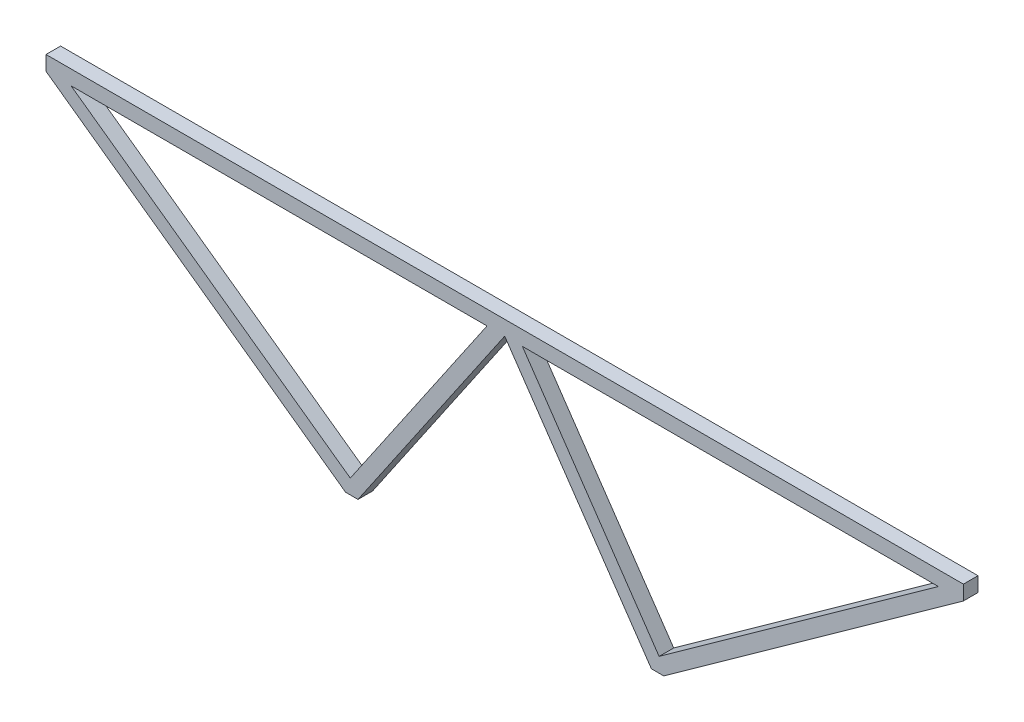
ISO-10303-21;
HEADER;
FILE_DESCRIPTION(('STEP AP214'),'2;1');
FILE_NAME('part.step','',(''),(''),'','','');
FILE_SCHEMA(('AUTOMOTIVE_DESIGN { 1 0 10303 214 1 1 1 1 }'));
ENDSEC;
DATA;
#1=APPLICATION_CONTEXT('core data for automotive mechanical design processes');
#2=APPLICATION_PROTOCOL_DEFINITION('international standard','automotive_design',2000,#1);
#3=PRODUCT_CONTEXT('',#1,'mechanical');
#4=PRODUCT('Part','Part','',(#3));
#5=PRODUCT_RELATED_PRODUCT_CATEGORY('part','',(#4));
#6=PRODUCT_DEFINITION_FORMATION('','',#4);
#7=PRODUCT_DEFINITION_CONTEXT('part definition',#1,'design');
#8=PRODUCT_DEFINITION('design','',#6,#7);
#9=PRODUCT_DEFINITION_SHAPE('','',#8);
#10=(LENGTH_UNIT() NAMED_UNIT(*) SI_UNIT(.MILLI.,.METRE.));
#11=(NAMED_UNIT(*) PLANE_ANGLE_UNIT() SI_UNIT($,.RADIAN.));
#12=(NAMED_UNIT(*) SI_UNIT($,.STERADIAN.) SOLID_ANGLE_UNIT());
#13=UNCERTAINTY_MEASURE_WITH_UNIT(LENGTH_MEASURE(1.E-05),#10,'distance_accuracy_value','');
#14=(GEOMETRIC_REPRESENTATION_CONTEXT(3) GLOBAL_UNCERTAINTY_ASSIGNED_CONTEXT((#13)) GLOBAL_UNIT_ASSIGNED_CONTEXT((#10,
#11,#12)) REPRESENTATION_CONTEXT('',''));
#15=CARTESIAN_POINT('',(0.,0.,0.));
#16=DIRECTION('',(0.,0.,1.));
#17=DIRECTION('',(1.,0.,0.));
#18=AXIS2_PLACEMENT_3D('',#15,#16,#17);
#19=CARTESIAN_POINT('',(0.,0.,19.1));
#20=DIRECTION('',(0.,0.,-1.));
#21=DIRECTION('',(-1.,0.,0.));
#22=AXIS2_PLACEMENT_3D('',#19,#20,#21);
#23=PLANE('',#22);
#24=DIRECTION('',(0.564071784532691,0.825725754651086,0.));
#25=VECTOR('',#24,1.);
#26=CARTESIAN_POINT('',(576.868833396058,-19.1,19.1));
#27=LINE('',#26,#25);
#28=CARTESIAN_POINT('',(398.027381062942,-280.9,19.1));
#29=VERTEX_POINT('',#28);
#30=CARTESIAN_POINT('',(576.868833396058,-19.1,19.1));
#31=VERTEX_POINT('',#30);
#32=EDGE_CURVE('E180',#29,#31,#27,.T.);
#33=ORIENTED_EDGE('',*,*,#32,.F.);
#34=DIRECTION('',(0.812771804546655,-0.582582177665927,0.));
#35=VECTOR('',#34,1.);
#36=CARTESIAN_POINT('',(398.027381062942,-280.9,19.1));
#37=LINE('',#36,#35);
#38=CARTESIAN_POINT('',(32.785074333243,-19.1,19.1));
#39=VERTEX_POINT('',#38);
#40=EDGE_CURVE('E183',#39,#29,#37,.T.);
#41=ORIENTED_EDGE('',*,*,#40,.F.);
#42=DIRECTION('',(-1.,0.,0.));
#43=VECTOR('',#42,1.);
#44=CARTESIAN_POINT('',(32.785074333243,-19.1,19.1));
#45=LINE('',#44,#43);
#46=EDGE_CURVE('E177',#31,#39,#45,.T.);
#47=ORIENTED_EDGE('',*,*,#46,.F.);
#48=EDGE_LOOP('',(#33,#41,#47));
#49=FACE_BOUND('',#48,.T.);
#50=DIRECTION('',(-1.,0.,0.));
#51=VECTOR('',#50,1.);
#52=CARTESIAN_POINT('',(0.,0.,19.1));
#53=LINE('',#52,#51);
#54=CARTESIAN_POINT('',(1200.,0.,19.1));
#55=VERTEX_POINT('',#54);
#56=CARTESIAN_POINT('',(0.,0.,19.1));
#57=VERTEX_POINT('',#56);
#58=EDGE_CURVE('E202',#55,#57,#53,.T.);
#59=ORIENTED_EDGE('',*,*,#58,.T.);
#60=DIRECTION('',(0.,-1.,0.));
#61=VECTOR('',#60,1.);
#62=CARTESIAN_POINT('',(0.,0.,19.1));
#63=LINE('',#62,#61);
#64=CARTESIAN_POINT('',(0.,-19.1,19.1));
#65=VERTEX_POINT('',#64);
#66=EDGE_CURVE('E204',#57,#65,#63,.T.);
#67=ORIENTED_EDGE('',*,*,#66,.T.);
#68=DIRECTION('',(0.812771804546655,-0.582582177665927,0.));
#69=VECTOR('',#68,1.);
#70=CARTESIAN_POINT('',(391.889090757725,-300.,19.1));
#71=LINE('',#70,#69);
#72=CARTESIAN_POINT('',(391.889090757725,-300.,19.1));
#73=VERTEX_POINT('',#72);
#74=EDGE_CURVE('E210',#65,#73,#71,.T.);
#75=ORIENTED_EDGE('',*,*,#74,.T.);
#76=DIRECTION('',(1.,0.,0.));
#77=VECTOR('',#76,1.);
#78=CARTESIAN_POINT('',(391.889090757725,-300.,19.1));
#79=LINE('',#78,#77);
#80=CARTESIAN_POINT('',(408.110909242275,-300.,19.1));
#81=VERTEX_POINT('',#80);
#82=EDGE_CURVE('E207',#73,#81,#79,.T.);
#83=ORIENTED_EDGE('',*,*,#82,.T.);
#84=DIRECTION('',(0.564071784532684,0.825725754651091,0.));
#85=VECTOR('',#84,1.);
#86=CARTESIAN_POINT('',(408.110909242275,-300.,19.1));
#87=LINE('',#86,#85);
#88=CARTESIAN_POINT('',(599.999999999996,-19.1,19.1));
#89=VERTEX_POINT('',#88);
#90=EDGE_CURVE('E213',#81,#89,#87,.T.);
#91=ORIENTED_EDGE('',*,*,#90,.T.);
#92=DIRECTION('',(0.564071784532698,-0.825725754651081,0.));
#93=VECTOR('',#92,1.);
#94=CARTESIAN_POINT('',(791.889090757725,-300.,19.1));
#95=LINE('',#94,#93);
#96=CARTESIAN_POINT('',(791.889090757725,-300.,19.1));
#97=VERTEX_POINT('',#96);
#98=EDGE_CURVE('E211',#89,#97,#95,.T.);
#99=ORIENTED_EDGE('',*,*,#98,.T.);
#100=DIRECTION('',(1.,0.,0.));
#101=VECTOR('',#100,1.);
#102=CARTESIAN_POINT('',(808.110909242275,-300.,19.1));
#103=LINE('',#102,#101);
#104=CARTESIAN_POINT('',(808.110909242275,-300.,19.1));
#105=VERTEX_POINT('',#104);
#106=EDGE_CURVE('E214',#97,#105,#103,.T.);
#107=ORIENTED_EDGE('',*,*,#106,.T.);
#108=DIRECTION('',(0.812771804546655,0.582582177665927,0.));
#109=VECTOR('',#108,1.);
#110=CARTESIAN_POINT('',(808.110909242275,-300.,19.1));
#111=LINE('',#110,#109);
#112=CARTESIAN_POINT('',(1200.,-19.1,19.1));
#113=VERTEX_POINT('',#112);
#114=EDGE_CURVE('E220',#105,#113,#111,.T.);
#115=ORIENTED_EDGE('',*,*,#114,.T.);
#116=DIRECTION('',(0.,1.,0.));
#117=VECTOR('',#116,1.);
#118=CARTESIAN_POINT('',(1200.,0.,19.1));
#119=LINE('',#118,#117);
#120=EDGE_CURVE('E219',#113,#55,#119,.T.);
#121=ORIENTED_EDGE('',*,*,#120,.T.);
#122=EDGE_LOOP('',(#59,#67,#75,#83,#91,#99,#107,#115,#121));
#123=FACE_BOUND('',#122,.T.);
#124=DIRECTION('',(0.564071784532684,-0.825725754651091,0.));
#125=VECTOR('',#124,1.);
#126=CARTESIAN_POINT('',(623.131166603945,-19.1,19.1));
#127=LINE('',#126,#125);
#128=CARTESIAN_POINT('',(623.131166603945,-19.1,19.1));
#129=VERTEX_POINT('',#128);
#130=CARTESIAN_POINT('',(801.972618937058,-280.9,19.1));
#131=VERTEX_POINT('',#130);
#132=EDGE_CURVE('E148',#129,#131,#127,.T.);
#133=ORIENTED_EDGE('',*,*,#132,.F.);
#134=DIRECTION('',(-1.,0.,0.));
#135=VECTOR('',#134,1.);
#136=CARTESIAN_POINT('',(1167.21492566676,-19.1,19.1));
#137=LINE('',#136,#135);
#138=CARTESIAN_POINT('',(1167.21492566676,-19.1,19.1));
#139=VERTEX_POINT('',#138);
#140=EDGE_CURVE('E167',#139,#129,#137,.T.);
#141=ORIENTED_EDGE('',*,*,#140,.F.);
#142=DIRECTION('',(0.812771804546655,0.582582177665927,0.));
#143=VECTOR('',#142,1.);
#144=CARTESIAN_POINT('',(801.972618937058,-280.9,19.1));
#145=LINE('',#144,#143);
#146=EDGE_CURVE('E156',#131,#139,#145,.T.);
#147=ORIENTED_EDGE('',*,*,#146,.F.);
#148=EDGE_LOOP('',(#133,#141,#147));
#149=FACE_BOUND('',#148,.T.);
#150=ADVANCED_FACE('F43',(#49,#123,#149),#23,.F.);
#151=CARTESIAN_POINT('',(0.,0.,0.));
#152=DIRECTION('',(0.,0.,-1.));
#153=DIRECTION('',(-1.,0.,0.));
#154=AXIS2_PLACEMENT_3D('',#151,#152,#153);
#155=PLANE('',#154);
#156=DIRECTION('',(-1.,0.,0.));
#157=VECTOR('',#156,1.);
#158=CARTESIAN_POINT('',(0.,0.,0.));
#159=LINE('',#158,#157);
#160=CARTESIAN_POINT('',(1200.,0.,0.));
#161=VERTEX_POINT('',#160);
#162=CARTESIAN_POINT('',(0.,0.,0.));
#163=VERTEX_POINT('',#162);
#164=EDGE_CURVE('E199',#161,#163,#159,.T.);
#165=ORIENTED_EDGE('',*,*,#164,.F.);
#166=DIRECTION('',(0.,1.,0.));
#167=VECTOR('',#166,1.);
#168=CARTESIAN_POINT('',(1200.,0.,0.));
#169=LINE('',#168,#167);
#170=CARTESIAN_POINT('',(1200.,-19.1,0.));
#171=VERTEX_POINT('',#170);
#172=EDGE_CURVE('E203',#171,#161,#169,.T.);
#173=ORIENTED_EDGE('',*,*,#172,.F.);
#174=DIRECTION('',(0.812771804546655,0.582582177665927,0.));
#175=VECTOR('',#174,1.);
#176=CARTESIAN_POINT('',(808.110909242275,-300.,0.));
#177=LINE('',#176,#175);
#178=CARTESIAN_POINT('',(808.110909242275,-300.,0.));
#179=VERTEX_POINT('',#178);
#180=EDGE_CURVE('E237',#179,#171,#177,.T.);
#181=ORIENTED_EDGE('',*,*,#180,.F.);
#182=DIRECTION('',(1.,0.,0.));
#183=VECTOR('',#182,1.);
#184=CARTESIAN_POINT('',(808.110909242275,-300.,0.));
#185=LINE('',#184,#183);
#186=CARTESIAN_POINT('',(791.889090757725,-300.,0.));
#187=VERTEX_POINT('',#186);
#188=EDGE_CURVE('E233',#187,#179,#185,.T.);
#189=ORIENTED_EDGE('',*,*,#188,.F.);
#190=DIRECTION('',(0.564071784532698,-0.825725754651081,0.));
#191=VECTOR('',#190,1.);
#192=CARTESIAN_POINT('',(791.889090757725,-300.,0.));
#193=LINE('',#192,#191);
#194=CARTESIAN_POINT('',(599.999999999996,-19.1,0.));
#195=VERTEX_POINT('',#194);
#196=EDGE_CURVE('E235',#195,#187,#193,.T.);
#197=ORIENTED_EDGE('',*,*,#196,.F.);
#198=DIRECTION('',(0.564071784532684,0.825725754651091,0.));
#199=VECTOR('',#198,1.);
#200=CARTESIAN_POINT('',(408.110909242275,-300.,0.));
#201=LINE('',#200,#199);
#202=CARTESIAN_POINT('',(408.110909242275,-300.,0.));
#203=VERTEX_POINT('',#202);
#204=EDGE_CURVE('E229',#203,#195,#201,.T.);
#205=ORIENTED_EDGE('',*,*,#204,.F.);
#206=DIRECTION('',(1.,0.,0.));
#207=VECTOR('',#206,1.);
#208=CARTESIAN_POINT('',(391.889090757725,-300.,0.));
#209=LINE('',#208,#207);
#210=CARTESIAN_POINT('',(391.889090757725,-300.,0.));
#211=VERTEX_POINT('',#210);
#212=EDGE_CURVE('E228',#211,#203,#209,.T.);
#213=ORIENTED_EDGE('',*,*,#212,.F.);
#214=DIRECTION('',(0.812771804546655,-0.582582177665927,0.));
#215=VECTOR('',#214,1.);
#216=CARTESIAN_POINT('',(391.889090757725,-300.,0.));
#217=LINE('',#216,#215);
#218=CARTESIAN_POINT('',(0.,-19.1,0.));
#219=VERTEX_POINT('',#218);
#220=EDGE_CURVE('E226',#219,#211,#217,.T.);
#221=ORIENTED_EDGE('',*,*,#220,.F.);
#222=DIRECTION('',(0.,-1.,0.));
#223=VECTOR('',#222,1.);
#224=CARTESIAN_POINT('',(0.,0.,0.));
#225=LINE('',#224,#223);
#226=EDGE_CURVE('E222',#163,#219,#225,.T.);
#227=ORIENTED_EDGE('',*,*,#226,.F.);
#228=EDGE_LOOP('',(#165,#173,#181,#189,#197,#205,#213,#221,#227));
#229=FACE_BOUND('',#228,.T.);
#230=DIRECTION('',(0.812771804546655,-0.582582177665927,0.));
#231=VECTOR('',#230,1.);
#232=CARTESIAN_POINT('',(398.027381062942,-280.9,0.));
#233=LINE('',#232,#231);
#234=CARTESIAN_POINT('',(32.785074333243,-19.1,0.));
#235=VERTEX_POINT('',#234);
#236=CARTESIAN_POINT('',(398.027381062942,-280.9,0.));
#237=VERTEX_POINT('',#236);
#238=EDGE_CURVE('E179',#235,#237,#233,.T.);
#239=ORIENTED_EDGE('',*,*,#238,.T.);
#240=DIRECTION('',(0.564071784532691,0.825725754651086,0.));
#241=VECTOR('',#240,1.);
#242=CARTESIAN_POINT('',(576.868833396058,-19.1,0.));
#243=LINE('',#242,#241);
#244=CARTESIAN_POINT('',(576.868833396058,-19.1,0.));
#245=VERTEX_POINT('',#244);
#246=EDGE_CURVE('E164',#237,#245,#243,.T.);
#247=ORIENTED_EDGE('',*,*,#246,.T.);
#248=DIRECTION('',(-1.,0.,0.));
#249=VECTOR('',#248,1.);
#250=CARTESIAN_POINT('',(32.785074333243,-19.1,0.));
#251=LINE('',#250,#249);
#252=EDGE_CURVE('E187',#245,#235,#251,.T.);
#253=ORIENTED_EDGE('',*,*,#252,.T.);
#254=EDGE_LOOP('',(#239,#247,#253));
#255=FACE_BOUND('',#254,.T.);
#256=DIRECTION('',(-1.,0.,0.));
#257=VECTOR('',#256,1.);
#258=CARTESIAN_POINT('',(1167.21492566676,-19.1,0.));
#259=LINE('',#258,#257);
#260=CARTESIAN_POINT('',(1167.21492566676,-19.1,0.));
#261=VERTEX_POINT('',#260);
#262=CARTESIAN_POINT('',(623.131166603945,-19.1,0.));
#263=VERTEX_POINT('',#262);
#264=EDGE_CURVE('E159',#261,#263,#259,.T.);
#265=ORIENTED_EDGE('',*,*,#264,.T.);
#266=DIRECTION('',(0.564071784532684,-0.825725754651091,0.));
#267=VECTOR('',#266,1.);
#268=CARTESIAN_POINT('',(623.131166603945,-19.1,0.));
#269=LINE('',#268,#267);
#270=CARTESIAN_POINT('',(801.972618937058,-280.9,0.));
#271=VERTEX_POINT('',#270);
#272=EDGE_CURVE('E67',#263,#271,#269,.T.);
#273=ORIENTED_EDGE('',*,*,#272,.T.);
#274=DIRECTION('',(0.812771804546655,0.582582177665927,0.));
#275=VECTOR('',#274,1.);
#276=CARTESIAN_POINT('',(801.972618937058,-280.9,0.));
#277=LINE('',#276,#275);
#278=EDGE_CURVE('E162',#271,#261,#277,.T.);
#279=ORIENTED_EDGE('',*,*,#278,.T.);
#280=EDGE_LOOP('',(#265,#273,#279));
#281=FACE_BOUND('',#280,.T.);
#282=ADVANCED_FACE('F267',(#229,#255,#281),#155,.T.);
#283=CARTESIAN_POINT('',(0.,0.,19.1));
#284=DIRECTION('',(0.,-1.,0.));
#285=DIRECTION('',(0.,0.,-1.));
#286=AXIS2_PLACEMENT_3D('',#283,#284,#285);
#287=PLANE('',#286);
#288=ORIENTED_EDGE('',*,*,#164,.T.);
#289=DIRECTION('',(0.,0.,-1.));
#290=VECTOR('',#289,1.);
#291=CARTESIAN_POINT('',(0.,0.,19.1));
#292=LINE('',#291,#290);
#293=EDGE_CURVE('E11',#57,#163,#292,.T.);
#294=ORIENTED_EDGE('',*,*,#293,.F.);
#295=ORIENTED_EDGE('',*,*,#58,.F.);
#296=DIRECTION('',(0.,0.,-1.));
#297=VECTOR('',#296,1.);
#298=CARTESIAN_POINT('',(1200.,0.,19.1));
#299=LINE('',#298,#297);
#300=EDGE_CURVE('E221',#55,#161,#299,.T.);
#301=ORIENTED_EDGE('',*,*,#300,.T.);
#302=EDGE_LOOP('',(#288,#294,#295,#301));
#303=FACE_BOUND('',#302,.T.);
#304=ADVANCED_FACE('F44',(#303),#287,.F.);
#305=CARTESIAN_POINT('',(0.,0.,19.1));
#306=DIRECTION('',(1.,0.,0.));
#307=DIRECTION('',(0.,1.,0.));
#308=AXIS2_PLACEMENT_3D('',#305,#306,#307);
#309=PLANE('',#308);
#310=ORIENTED_EDGE('',*,*,#226,.T.);
#311=DIRECTION('',(0.,0.,-1.));
#312=VECTOR('',#311,1.);
#313=CARTESIAN_POINT('',(0.,-19.1,19.1));
#314=LINE('',#313,#312);
#315=EDGE_CURVE('E51',#65,#219,#314,.T.);
#316=ORIENTED_EDGE('',*,*,#315,.F.);
#317=ORIENTED_EDGE('',*,*,#66,.F.);
#318=ORIENTED_EDGE('',*,*,#293,.T.);
#319=EDGE_LOOP('',(#310,#316,#317,#318));
#320=FACE_BOUND('',#319,.T.);
#321=ADVANCED_FACE('F288',(#320),#309,.F.);
#322=CARTESIAN_POINT('',(391.889090757725,-300.,19.1));
#323=DIRECTION('',(0.582582177665927,0.812771804546655,0.));
#324=DIRECTION('',(-0.812771804546655,0.582582177665927,0.));
#325=AXIS2_PLACEMENT_3D('',#322,#323,#324);
#326=PLANE('',#325);
#327=ORIENTED_EDGE('',*,*,#220,.T.);
#328=DIRECTION('',(0.,0.,-1.));
#329=VECTOR('',#328,1.);
#330=CARTESIAN_POINT('',(391.889090757725,-300.,19.1));
#331=LINE('',#330,#329);
#332=EDGE_CURVE('E258',#73,#211,#331,.T.);
#333=ORIENTED_EDGE('',*,*,#332,.F.);
#334=ORIENTED_EDGE('',*,*,#74,.F.);
#335=ORIENTED_EDGE('',*,*,#315,.T.);
#336=EDGE_LOOP('',(#327,#333,#334,#335));
#337=FACE_BOUND('',#336,.T.);
#338=ADVANCED_FACE('F261',(#337),#326,.F.);
#339=CARTESIAN_POINT('',(391.889090757725,-300.,19.1));
#340=DIRECTION('',(0.,1.,0.));
#341=DIRECTION('',(0.,0.,1.));
#342=AXIS2_PLACEMENT_3D('',#339,#340,#341);
#343=PLANE('',#342);
#344=ORIENTED_EDGE('',*,*,#212,.T.);
#345=DIRECTION('',(0.,0.,-1.));
#346=VECTOR('',#345,1.);
#347=CARTESIAN_POINT('',(408.110909242275,-300.,19.1));
#348=LINE('',#347,#346);
#349=EDGE_CURVE('E251',#81,#203,#348,.T.);
#350=ORIENTED_EDGE('',*,*,#349,.F.);
#351=ORIENTED_EDGE('',*,*,#82,.F.);
#352=ORIENTED_EDGE('',*,*,#332,.T.);
#353=EDGE_LOOP('',(#344,#350,#351,#352));
#354=FACE_BOUND('',#353,.T.);
#355=ADVANCED_FACE('F274',(#354),#343,.F.);
#356=CARTESIAN_POINT('',(408.110909242275,-300.,19.1));
#357=DIRECTION('',(-0.82572575465109,0.564071784532684,0.));
#358=DIRECTION('',(-0.564071784532684,-0.825725754651091,0.));
#359=AXIS2_PLACEMENT_3D('',#356,#357,#358);
#360=PLANE('',#359);
#361=ORIENTED_EDGE('',*,*,#204,.T.);
#362=DIRECTION('',(0.,0.,-1.));
#363=VECTOR('',#362,1.);
#364=CARTESIAN_POINT('',(599.999999999996,-19.1,19.1));
#365=LINE('',#364,#363);
#366=EDGE_CURVE('E248',#89,#195,#365,.T.);
#367=ORIENTED_EDGE('',*,*,#366,.F.);
#368=ORIENTED_EDGE('',*,*,#90,.F.);
#369=ORIENTED_EDGE('',*,*,#349,.T.);
#370=EDGE_LOOP('',(#361,#367,#368,#369));
#371=FACE_BOUND('',#370,.T.);
#372=ADVANCED_FACE('F278',(#371),#360,.F.);
#373=CARTESIAN_POINT('',(791.889090757725,-300.,19.1));
#374=DIRECTION('',(0.825725754651081,0.564071784532698,0.));
#375=DIRECTION('',(-0.564071784532698,0.825725754651081,0.));
#376=AXIS2_PLACEMENT_3D('',#373,#374,#375);
#377=PLANE('',#376);
#378=ORIENTED_EDGE('',*,*,#196,.T.);
#379=DIRECTION('',(0.,0.,-1.));
#380=VECTOR('',#379,1.);
#381=CARTESIAN_POINT('',(791.889090757725,-300.,19.1));
#382=LINE('',#381,#380);
#383=EDGE_CURVE('E250',#97,#187,#382,.T.);
#384=ORIENTED_EDGE('',*,*,#383,.F.);
#385=ORIENTED_EDGE('',*,*,#98,.F.);
#386=ORIENTED_EDGE('',*,*,#366,.T.);
#387=EDGE_LOOP('',(#378,#384,#385,#386));
#388=FACE_BOUND('',#387,.T.);
#389=ADVANCED_FACE('F305',(#388),#377,.F.);
#390=CARTESIAN_POINT('',(808.110909242275,-300.,19.1));
#391=DIRECTION('',(0.,1.,0.));
#392=DIRECTION('',(0.,0.,1.));
#393=AXIS2_PLACEMENT_3D('',#390,#391,#392);
#394=PLANE('',#393);
#395=ORIENTED_EDGE('',*,*,#188,.T.);
#396=DIRECTION('',(0.,0.,-1.));
#397=VECTOR('',#396,1.);
#398=CARTESIAN_POINT('',(808.110909242275,-300.,19.1));
#399=LINE('',#398,#397);
#400=EDGE_CURVE('E242',#105,#179,#399,.T.);
#401=ORIENTED_EDGE('',*,*,#400,.F.);
#402=ORIENTED_EDGE('',*,*,#106,.F.);
#403=ORIENTED_EDGE('',*,*,#383,.T.);
#404=EDGE_LOOP('',(#395,#401,#402,#403));
#405=FACE_BOUND('',#404,.T.);
#406=ADVANCED_FACE('F302',(#405),#394,.F.);
#407=CARTESIAN_POINT('',(808.110909242275,-300.,19.1));
#408=DIRECTION('',(-0.582582177665927,0.812771804546655,0.));
#409=DIRECTION('',(-0.812771804546655,-0.582582177665927,0.));
#410=AXIS2_PLACEMENT_3D('',#407,#408,#409);
#411=PLANE('',#410);
#412=ORIENTED_EDGE('',*,*,#180,.T.);
#413=DIRECTION('',(0.,0.,-1.));
#414=VECTOR('',#413,1.);
#415=CARTESIAN_POINT('',(1200.,-19.1,19.1));
#416=LINE('',#415,#414);
#417=EDGE_CURVE('E243',#113,#171,#416,.T.);
#418=ORIENTED_EDGE('',*,*,#417,.F.);
#419=ORIENTED_EDGE('',*,*,#114,.F.);
#420=ORIENTED_EDGE('',*,*,#400,.T.);
#421=EDGE_LOOP('',(#412,#418,#419,#420));
#422=FACE_BOUND('',#421,.T.);
#423=ADVANCED_FACE('F296',(#422),#411,.F.);
#424=CARTESIAN_POINT('',(1200.,0.,19.1));
#425=DIRECTION('',(-1.,0.,0.));
#426=DIRECTION('',(0.,0.,1.));
#427=AXIS2_PLACEMENT_3D('',#424,#425,#426);
#428=PLANE('',#427);
#429=ORIENTED_EDGE('',*,*,#172,.T.);
#430=ORIENTED_EDGE('',*,*,#300,.F.);
#431=ORIENTED_EDGE('',*,*,#120,.F.);
#432=ORIENTED_EDGE('',*,*,#417,.T.);
#433=EDGE_LOOP('',(#429,#430,#431,#432));
#434=FACE_BOUND('',#433,.T.);
#435=ADVANCED_FACE('F291',(#434),#428,.F.);
#436=CARTESIAN_POINT('',(576.868833396058,-19.1,19.1));
#437=DIRECTION('',(-0.825725754651086,0.564071784532691,0.));
#438=DIRECTION('',(-0.564071784532691,-0.825725754651086,0.));
#439=AXIS2_PLACEMENT_3D('',#436,#437,#438);
#440=PLANE('',#439);
#441=ORIENTED_EDGE('',*,*,#246,.F.);
#442=DIRECTION('',(0.,0.,-1.));
#443=VECTOR('',#442,1.);
#444=CARTESIAN_POINT('',(398.027381062942,-280.9,19.1));
#445=LINE('',#444,#443);
#446=EDGE_CURVE('E184',#29,#237,#445,.T.);
#447=ORIENTED_EDGE('',*,*,#446,.F.);
#448=ORIENTED_EDGE('',*,*,#32,.T.);
#449=DIRECTION('',(0.,0.,-1.));
#450=VECTOR('',#449,1.);
#451=CARTESIAN_POINT('',(576.868833396058,-19.1,19.1));
#452=LINE('',#451,#450);
#453=EDGE_CURVE('E200',#31,#245,#452,.T.);
#454=ORIENTED_EDGE('',*,*,#453,.T.);
#455=EDGE_LOOP('',(#441,#447,#448,#454));
#456=FACE_BOUND('',#455,.T.);
#457=ADVANCED_FACE('F325',(#456),#440,.T.);
#458=CARTESIAN_POINT('',(32.785074333243,-19.1,19.1));
#459=DIRECTION('',(0.,-1.,0.));
#460=DIRECTION('',(0.,0.,-1.));
#461=AXIS2_PLACEMENT_3D('',#458,#459,#460);
#462=PLANE('',#461);
#463=ORIENTED_EDGE('',*,*,#252,.F.);
#464=ORIENTED_EDGE('',*,*,#453,.F.);
#465=ORIENTED_EDGE('',*,*,#46,.T.);
#466=DIRECTION('',(0.,0.,-1.));
#467=VECTOR('',#466,1.);
#468=CARTESIAN_POINT('',(32.785074333243,-19.1,19.1));
#469=LINE('',#468,#467);
#470=EDGE_CURVE('E193',#39,#235,#469,.T.);
#471=ORIENTED_EDGE('',*,*,#470,.T.);
#472=EDGE_LOOP('',(#463,#464,#465,#471));
#473=FACE_BOUND('',#472,.T.);
#474=ADVANCED_FACE('F342',(#473),#462,.T.);
#475=CARTESIAN_POINT('',(398.027381062942,-280.9,19.1));
#476=DIRECTION('',(0.582582177665927,0.812771804546655,0.));
#477=DIRECTION('',(-0.812771804546655,0.582582177665927,0.));
#478=AXIS2_PLACEMENT_3D('',#475,#476,#477);
#479=PLANE('',#478);
#480=ORIENTED_EDGE('',*,*,#238,.F.);
#481=ORIENTED_EDGE('',*,*,#470,.F.);
#482=ORIENTED_EDGE('',*,*,#40,.T.);
#483=ORIENTED_EDGE('',*,*,#446,.T.);
#484=EDGE_LOOP('',(#480,#481,#482,#483));
#485=FACE_BOUND('',#484,.T.);
#486=ADVANCED_FACE('F355',(#485),#479,.T.);
#487=CARTESIAN_POINT('',(623.131166603945,-19.1,19.1));
#488=DIRECTION('',(0.825725754651091,0.564071784532684,0.));
#489=DIRECTION('',(-0.564071784532684,0.825725754651091,0.));
#490=AXIS2_PLACEMENT_3D('',#487,#488,#489);
#491=PLANE('',#490);
#492=ORIENTED_EDGE('',*,*,#272,.F.);
#493=DIRECTION('',(0.,0.,-1.));
#494=VECTOR('',#493,1.);
#495=CARTESIAN_POINT('',(623.131166603945,-19.1,19.1));
#496=LINE('',#495,#494);
#497=EDGE_CURVE('E152',#129,#263,#496,.T.);
#498=ORIENTED_EDGE('',*,*,#497,.F.);
#499=ORIENTED_EDGE('',*,*,#132,.T.);
#500=DIRECTION('',(0.,0.,-1.));
#501=VECTOR('',#500,1.);
#502=CARTESIAN_POINT('',(801.972618937058,-280.9,19.1));
#503=LINE('',#502,#501);
#504=EDGE_CURVE('E151',#131,#271,#503,.T.);
#505=ORIENTED_EDGE('',*,*,#504,.T.);
#506=EDGE_LOOP('',(#492,#498,#499,#505));
#507=FACE_BOUND('',#506,.T.);
#508=ADVANCED_FACE('F155',(#507),#491,.T.);
#509=CARTESIAN_POINT('',(801.972618937058,-280.9,19.1));
#510=DIRECTION('',(-0.582582177665927,0.812771804546655,0.));
#511=DIRECTION('',(-0.812771804546655,-0.582582177665927,0.));
#512=AXIS2_PLACEMENT_3D('',#509,#510,#511);
#513=PLANE('',#512);
#514=ORIENTED_EDGE('',*,*,#278,.F.);
#515=ORIENTED_EDGE('',*,*,#504,.F.);
#516=ORIENTED_EDGE('',*,*,#146,.T.);
#517=DIRECTION('',(0.,0.,-1.));
#518=VECTOR('',#517,1.);
#519=CARTESIAN_POINT('',(1167.21492566676,-19.1,19.1));
#520=LINE('',#519,#518);
#521=EDGE_CURVE('E59',#139,#261,#520,.T.);
#522=ORIENTED_EDGE('',*,*,#521,.T.);
#523=EDGE_LOOP('',(#514,#515,#516,#522));
#524=FACE_BOUND('',#523,.T.);
#525=ADVANCED_FACE('F165',(#524),#513,.T.);
#526=CARTESIAN_POINT('',(1167.21492566676,-19.1,19.1));
#527=DIRECTION('',(0.,-1.,0.));
#528=DIRECTION('',(0.,0.,-1.));
#529=AXIS2_PLACEMENT_3D('',#526,#527,#528);
#530=PLANE('',#529);
#531=ORIENTED_EDGE('',*,*,#264,.F.);
#532=ORIENTED_EDGE('',*,*,#521,.F.);
#533=ORIENTED_EDGE('',*,*,#140,.T.);
#534=ORIENTED_EDGE('',*,*,#497,.T.);
#535=EDGE_LOOP('',(#531,#532,#533,#534));
#536=FACE_BOUND('',#535,.T.);
#537=ADVANCED_FACE('F373',(#536),#530,.T.);
#538=CLOSED_SHELL('',(#150,#282,#304,#321,#338,#355,#372,#389,#406,#423,#435,#457,#474,#486,
#508,#525,#537));
#539=MANIFOLD_SOLID_BREP('B2',#538);
#540=ADVANCED_BREP_SHAPE_REPRESENTATION('',(#18,#539),#14);
#541=SHAPE_DEFINITION_REPRESENTATION(#9,#540);
ENDSEC;
END-ISO-10303-21;
